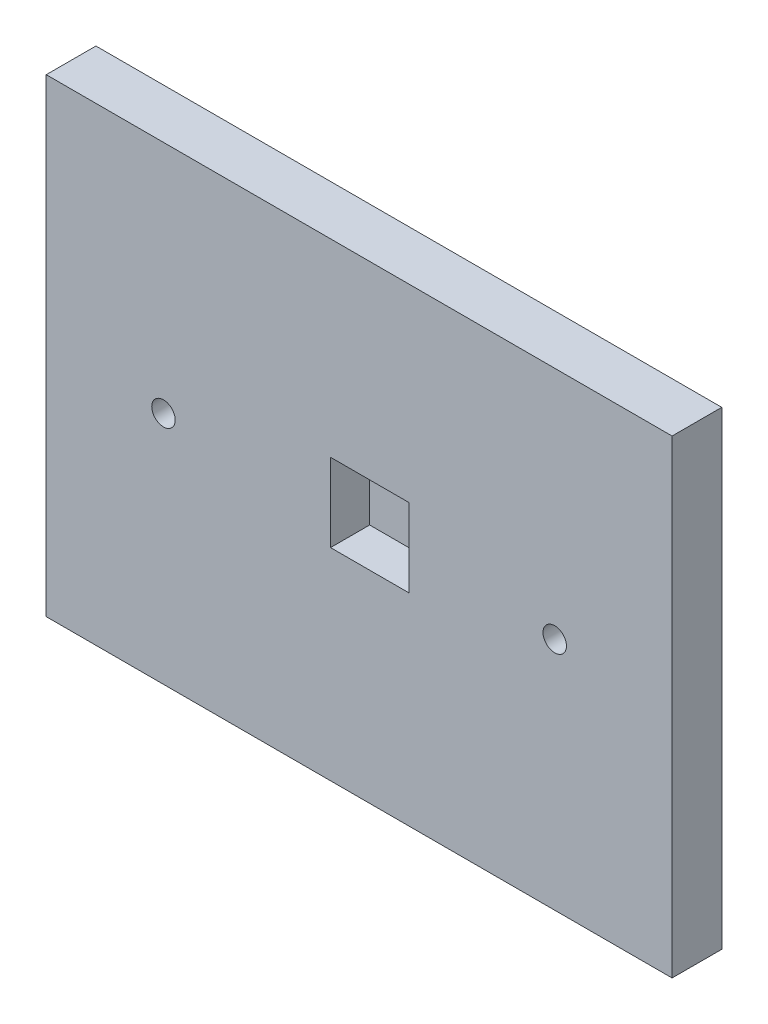
ISO-10303-21;
HEADER;
FILE_DESCRIPTION(('STEP AP214'),'2;1');
FILE_NAME('part.step','',(''),(''),'','','');
FILE_SCHEMA(('AUTOMOTIVE_DESIGN { 1 0 10303 214 1 1 1 1 }'));
ENDSEC;
DATA;
#1=APPLICATION_CONTEXT('core data for automotive mechanical design processes');
#2=APPLICATION_PROTOCOL_DEFINITION('international standard','automotive_design',2000,#1);
#3=PRODUCT_CONTEXT('',#1,'mechanical');
#4=PRODUCT('Part','Part','',(#3));
#5=PRODUCT_RELATED_PRODUCT_CATEGORY('part','',(#4));
#6=PRODUCT_DEFINITION_FORMATION('','',#4);
#7=PRODUCT_DEFINITION_CONTEXT('part definition',#1,'design');
#8=PRODUCT_DEFINITION('design','',#6,#7);
#9=PRODUCT_DEFINITION_SHAPE('','',#8);
#10=(LENGTH_UNIT() NAMED_UNIT(*) SI_UNIT(.MILLI.,.METRE.));
#11=(NAMED_UNIT(*) PLANE_ANGLE_UNIT() SI_UNIT($,.RADIAN.));
#12=(NAMED_UNIT(*) SI_UNIT($,.STERADIAN.) SOLID_ANGLE_UNIT());
#13=UNCERTAINTY_MEASURE_WITH_UNIT(LENGTH_MEASURE(1.E-05),#10,'distance_accuracy_value','');
#14=(GEOMETRIC_REPRESENTATION_CONTEXT(3) GLOBAL_UNCERTAINTY_ASSIGNED_CONTEXT((#13)) GLOBAL_UNIT_ASSIGNED_CONTEXT((#10,
#11,#12)) REPRESENTATION_CONTEXT('',''));
#15=CARTESIAN_POINT('',(0.,0.,0.));
#16=DIRECTION('',(0.,0.,1.));
#17=DIRECTION('',(1.,0.,0.));
#18=AXIS2_PLACEMENT_3D('',#15,#16,#17);
#19=CARTESIAN_POINT('',(0.,0.,12.7));
#20=DIRECTION('',(0.,0.,1.));
#21=DIRECTION('',(1.,0.,0.));
#22=AXIS2_PLACEMENT_3D('',#19,#20,#21);
#23=PLANE('',#22);
#24=DIRECTION('',(0.,1.,0.));
#25=VECTOR('',#24,1.);
#26=CARTESIAN_POINT('',(60.2204381177103,-2.07911046818367,12.7));
#27=LINE('',#26,#25);
#28=CARTESIAN_POINT('',(60.2204381177103,-22.0791104681837,12.7));
#29=VERTEX_POINT('',#28);
#30=CARTESIAN_POINT('',(60.2204381177103,-2.07911046818367,12.7));
#31=VERTEX_POINT('',#30);
#32=EDGE_CURVE('E48',#29,#31,#27,.T.);
#33=ORIENTED_EDGE('',*,*,#32,.F.);
#34=DIRECTION('',(1.,0.,0.));
#35=VECTOR('',#34,1.);
#36=CARTESIAN_POINT('',(40.2204381177103,-22.0791104681837,12.7));
#37=LINE('',#36,#35);
#38=CARTESIAN_POINT('',(40.2204381177103,-22.0791104681837,12.7));
#39=VERTEX_POINT('',#38);
#40=EDGE_CURVE('E127',#39,#29,#37,.T.);
#41=ORIENTED_EDGE('',*,*,#40,.F.);
#42=DIRECTION('',(0.,-1.,0.));
#43=VECTOR('',#42,1.);
#44=CARTESIAN_POINT('',(40.2204381177103,-2.07911046818367,12.7));
#45=LINE('',#44,#43);
#46=CARTESIAN_POINT('',(40.2204381177103,-2.07911046818367,12.7));
#47=VERTEX_POINT('',#46);
#48=EDGE_CURVE('E130',#47,#39,#45,.T.);
#49=ORIENTED_EDGE('',*,*,#48,.F.);
#50=DIRECTION('',(-1.,0.,0.));
#51=VECTOR('',#50,1.);
#52=CARTESIAN_POINT('',(40.2204381177103,-2.07911046818367,12.7));
#53=LINE('',#52,#51);
#54=EDGE_CURVE('E136',#31,#47,#53,.T.);
#55=ORIENTED_EDGE('',*,*,#54,.F.);
#56=EDGE_LOOP('',(#33,#41,#49,#55));
#57=FACE_BOUND('',#56,.T.);
#58=CARTESIAN_POINT('',(97.5422311839731,-13.7142857142857,12.7));
#59=DIRECTION('',(0.,0.,1.));
#60=DIRECTION('',(1.,0.,0.));
#61=AXIS2_PLACEMENT_3D('',#58,#59,#60);
#62=CIRCLE('',#61,3.00000000000001);
#63=CARTESIAN_POINT('',(94.5422311839731,-13.7142857142857,12.7));
#64=VERTEX_POINT('',#63);
#65=EDGE_CURVE('E152',#64,#64,#62,.T.);
#66=ORIENTED_EDGE('',*,*,#65,.F.);
#67=EDGE_LOOP('',(#66));
#68=FACE_BOUND('',#67,.T.);
#69=DIRECTION('',(0.,-1.,0.));
#70=VECTOR('',#69,1.);
#71=CARTESIAN_POINT('',(-32.4570768571429,46.2857142857143,12.7));
#72=LINE('',#71,#70);
#73=CARTESIAN_POINT('',(-32.4570768571429,46.2857142857143,12.7));
#74=VERTEX_POINT('',#73);
#75=CARTESIAN_POINT('',(-32.4570768571428,-73.7142857142857,12.7));
#76=VERTEX_POINT('',#75);
#77=EDGE_CURVE('E158',#74,#76,#72,.T.);
#78=ORIENTED_EDGE('',*,*,#77,.T.);
#79=DIRECTION('',(1.,0.,0.));
#80=VECTOR('',#79,1.);
#81=CARTESIAN_POINT('',(-32.4570768571428,-73.7142857142857,12.7));
#82=LINE('',#81,#80);
#83=CARTESIAN_POINT('',(127.542857142857,-73.7142857142857,12.7));
#84=VERTEX_POINT('',#83);
#85=EDGE_CURVE('E85',#76,#84,#82,.T.);
#86=ORIENTED_EDGE('',*,*,#85,.T.);
#87=DIRECTION('',(0.,1.,0.));
#88=VECTOR('',#87,1.);
#89=CARTESIAN_POINT('',(127.542857142857,46.2857142857143,12.7));
#90=LINE('',#89,#88);
#91=CARTESIAN_POINT('',(127.542857142857,46.2857142857143,12.7));
#92=VERTEX_POINT('',#91);
#93=EDGE_CURVE('E161',#84,#92,#90,.T.);
#94=ORIENTED_EDGE('',*,*,#93,.T.);
#95=DIRECTION('',(-1.,0.,0.));
#96=VECTOR('',#95,1.);
#97=CARTESIAN_POINT('',(-32.4570768571429,46.2857142857143,12.7));
#98=LINE('',#97,#96);
#99=EDGE_CURVE('E57',#92,#74,#98,.T.);
#100=ORIENTED_EDGE('',*,*,#99,.T.);
#101=EDGE_LOOP('',(#78,#86,#94,#100));
#102=FACE_BOUND('',#101,.T.);
#103=CARTESIAN_POINT('',(-2.48592772301937,-13.7142857142857,12.7));
#104=DIRECTION('',(0.,0.,1.));
#105=DIRECTION('',(1.,0.,0.));
#106=AXIS2_PLACEMENT_3D('',#103,#104,#105);
#107=CIRCLE('',#106,3.);
#108=CARTESIAN_POINT('',(-5.48592772301937,-13.7142857142857,12.7));
#109=VERTEX_POINT('',#108);
#110=EDGE_CURVE('E146',#109,#109,#107,.T.);
#111=ORIENTED_EDGE('',*,*,#110,.F.);
#112=EDGE_LOOP('',(#111));
#113=FACE_BOUND('',#112,.T.);
#114=ADVANCED_FACE('F33',(#57,#68,#102,#113),#23,.T.);
#115=CARTESIAN_POINT('',(0.,0.,0.));
#116=DIRECTION('',(0.,0.,1.));
#117=DIRECTION('',(1.,0.,0.));
#118=AXIS2_PLACEMENT_3D('',#115,#116,#117);
#119=PLANE('',#118);
#120=DIRECTION('',(0.,-1.,0.));
#121=VECTOR('',#120,1.);
#122=CARTESIAN_POINT('',(-32.4570768571429,46.2857142857143,0.));
#123=LINE('',#122,#121);
#124=CARTESIAN_POINT('',(-32.4570768571429,46.2857142857143,0.));
#125=VERTEX_POINT('',#124);
#126=CARTESIAN_POINT('',(-32.4570768571428,-73.7142857142857,0.));
#127=VERTEX_POINT('',#126);
#128=EDGE_CURVE('E155',#125,#127,#123,.T.);
#129=ORIENTED_EDGE('',*,*,#128,.F.);
#130=DIRECTION('',(-1.,0.,0.));
#131=VECTOR('',#130,1.);
#132=CARTESIAN_POINT('',(-32.4570768571429,46.2857142857143,0.));
#133=LINE('',#132,#131);
#134=CARTESIAN_POINT('',(127.542857142857,46.2857142857143,0.));
#135=VERTEX_POINT('',#134);
#136=EDGE_CURVE('E78',#135,#125,#133,.T.);
#137=ORIENTED_EDGE('',*,*,#136,.F.);
#138=DIRECTION('',(0.,1.,0.));
#139=VECTOR('',#138,1.);
#140=CARTESIAN_POINT('',(127.542857142857,46.2857142857143,0.));
#141=LINE('',#140,#139);
#142=CARTESIAN_POINT('',(127.542857142857,-73.7142857142857,0.));
#143=VERTEX_POINT('',#142);
#144=EDGE_CURVE('E169',#143,#135,#141,.T.);
#145=ORIENTED_EDGE('',*,*,#144,.F.);
#146=DIRECTION('',(1.,0.,0.));
#147=VECTOR('',#146,1.);
#148=CARTESIAN_POINT('',(-32.4570768571428,-73.7142857142857,0.));
#149=LINE('',#148,#147);
#150=EDGE_CURVE('E167',#127,#143,#149,.T.);
#151=ORIENTED_EDGE('',*,*,#150,.F.);
#152=EDGE_LOOP('',(#129,#137,#145,#151));
#153=FACE_BOUND('',#152,.T.);
#154=CARTESIAN_POINT('',(97.5422311839731,-13.7142857142857,0.));
#155=DIRECTION('',(0.,0.,1.));
#156=DIRECTION('',(1.,0.,0.));
#157=AXIS2_PLACEMENT_3D('',#154,#155,#156);
#158=CIRCLE('',#157,3.00000000000001);
#159=CARTESIAN_POINT('',(94.5422311839731,-13.7142857142857,0.));
#160=VERTEX_POINT('',#159);
#161=EDGE_CURVE('E149',#160,#160,#158,.T.);
#162=ORIENTED_EDGE('',*,*,#161,.T.);
#163=EDGE_LOOP('',(#162));
#164=FACE_BOUND('',#163,.T.);
#165=CARTESIAN_POINT('',(-2.48592772301937,-13.7142857142857,0.));
#166=DIRECTION('',(0.,0.,1.));
#167=DIRECTION('',(1.,0.,0.));
#168=AXIS2_PLACEMENT_3D('',#165,#166,#167);
#169=CIRCLE('',#168,3.);
#170=CARTESIAN_POINT('',(-5.48592772301937,-13.7142857142857,0.));
#171=VERTEX_POINT('',#170);
#172=EDGE_CURVE('E142',#171,#171,#169,.T.);
#173=ORIENTED_EDGE('',*,*,#172,.T.);
#174=EDGE_LOOP('',(#173));
#175=FACE_BOUND('',#174,.T.);
#176=ADVANCED_FACE('F182',(#153,#164,#175),#119,.F.);
#177=CARTESIAN_POINT('',(-32.4570768571429,46.2857142857143,12.7));
#178=DIRECTION('',(1.,0.,0.));
#179=DIRECTION('',(0.,1.,0.));
#180=AXIS2_PLACEMENT_3D('',#177,#178,#179);
#181=PLANE('',#180);
#182=ORIENTED_EDGE('',*,*,#128,.T.);
#183=DIRECTION('',(0.,0.,-1.));
#184=VECTOR('',#183,1.);
#185=CARTESIAN_POINT('',(-32.4570768571428,-73.7142857142857,12.7));
#186=LINE('',#185,#184);
#187=EDGE_CURVE('E11',#76,#127,#186,.T.);
#188=ORIENTED_EDGE('',*,*,#187,.F.);
#189=ORIENTED_EDGE('',*,*,#77,.F.);
#190=DIRECTION('',(0.,0.,-1.));
#191=VECTOR('',#190,1.);
#192=CARTESIAN_POINT('',(-32.4570768571429,46.2857142857143,12.7));
#193=LINE('',#192,#191);
#194=EDGE_CURVE('E164',#74,#125,#193,.T.);
#195=ORIENTED_EDGE('',*,*,#194,.T.);
#196=EDGE_LOOP('',(#182,#188,#189,#195));
#197=FACE_BOUND('',#196,.T.);
#198=ADVANCED_FACE('F35',(#197),#181,.F.);
#199=CARTESIAN_POINT('',(-32.4570768571428,-73.7142857142857,12.7));
#200=DIRECTION('',(0.,1.,0.));
#201=DIRECTION('',(0.,0.,1.));
#202=AXIS2_PLACEMENT_3D('',#199,#200,#201);
#203=PLANE('',#202);
#204=ORIENTED_EDGE('',*,*,#150,.T.);
#205=DIRECTION('',(0.,0.,-1.));
#206=VECTOR('',#205,1.);
#207=CARTESIAN_POINT('',(127.542857142857,-73.7142857142857,12.7));
#208=LINE('',#207,#206);
#209=EDGE_CURVE('E41',#84,#143,#208,.T.);
#210=ORIENTED_EDGE('',*,*,#209,.F.);
#211=ORIENTED_EDGE('',*,*,#85,.F.);
#212=ORIENTED_EDGE('',*,*,#187,.T.);
#213=EDGE_LOOP('',(#204,#210,#211,#212));
#214=FACE_BOUND('',#213,.T.);
#215=ADVANCED_FACE('F198',(#214),#203,.F.);
#216=CARTESIAN_POINT('',(127.542857142857,46.2857142857143,12.7));
#217=DIRECTION('',(-1.,0.,0.));
#218=DIRECTION('',(0.,0.,1.));
#219=AXIS2_PLACEMENT_3D('',#216,#217,#218);
#220=PLANE('',#219);
#221=ORIENTED_EDGE('',*,*,#144,.T.);
#222=DIRECTION('',(0.,0.,-1.));
#223=VECTOR('',#222,1.);
#224=CARTESIAN_POINT('',(127.542857142857,46.2857142857143,12.7));
#225=LINE('',#224,#223);
#226=EDGE_CURVE('E173',#92,#135,#225,.T.);
#227=ORIENTED_EDGE('',*,*,#226,.F.);
#228=ORIENTED_EDGE('',*,*,#93,.F.);
#229=ORIENTED_EDGE('',*,*,#209,.T.);
#230=EDGE_LOOP('',(#221,#227,#228,#229));
#231=FACE_BOUND('',#230,.T.);
#232=ADVANCED_FACE('F178',(#231),#220,.F.);
#233=CARTESIAN_POINT('',(-32.4570768571429,46.2857142857143,12.7));
#234=DIRECTION('',(0.,-1.,0.));
#235=DIRECTION('',(0.,0.,-1.));
#236=AXIS2_PLACEMENT_3D('',#233,#234,#235);
#237=PLANE('',#236);
#238=ORIENTED_EDGE('',*,*,#136,.T.);
#239=ORIENTED_EDGE('',*,*,#194,.F.);
#240=ORIENTED_EDGE('',*,*,#99,.F.);
#241=ORIENTED_EDGE('',*,*,#226,.T.);
#242=EDGE_LOOP('',(#238,#239,#240,#241));
#243=FACE_BOUND('',#242,.T.);
#244=ADVANCED_FACE('F187',(#243),#237,.F.);
#245=CARTESIAN_POINT('',(97.5422311839731,-13.7142857142857,12.7));
#246=DIRECTION('',(0.,0.,-1.));
#247=DIRECTION('',(-1.,0.,0.));
#248=AXIS2_PLACEMENT_3D('',#245,#246,#247);
#249=CYLINDRICAL_SURFACE('',#248,3.00000000000001);
#250=CARTESIAN_POINT('',(94.5422311839731,-13.7142857142857,12.7));
#251=CARTESIAN_POINT('',(94.5422311839731,-13.7142857142857,12.5677083333333));
#252=CARTESIAN_POINT('',(94.5422311839731,-13.7142857142857,12.4354166666667));
#253=CARTESIAN_POINT('',(94.5422311839731,-13.7142857142857,12.1708333333333));
#254=CARTESIAN_POINT('',(94.5422311839731,-13.7142857142857,12.0385416666667));
#255=CARTESIAN_POINT('',(94.5422311839731,-13.7142857142857,11.7739583333333));
#256=CARTESIAN_POINT('',(94.5422311839731,-13.7142857142857,11.6416666666667));
#257=CARTESIAN_POINT('',(94.5422311839731,-13.7142857142857,11.3770833333333));
#258=CARTESIAN_POINT('',(94.5422311839731,-13.7142857142857,11.2447916666667));
#259=CARTESIAN_POINT('',(94.5422311839731,-13.7142857142857,10.9802083333333));
#260=CARTESIAN_POINT('',(94.5422311839731,-13.7142857142857,10.8479166666667));
#261=CARTESIAN_POINT('',(94.5422311839731,-13.7142857142857,10.5833333333333));
#262=CARTESIAN_POINT('',(94.5422311839731,-13.7142857142857,10.4510416666667));
#263=CARTESIAN_POINT('',(94.5422311839731,-13.7142857142857,10.1864583333333));
#264=CARTESIAN_POINT('',(94.5422311839731,-13.7142857142857,10.0541666666667));
#265=CARTESIAN_POINT('',(94.5422311839731,-13.7142857142857,9.78958333333333));
#266=CARTESIAN_POINT('',(94.5422311839731,-13.7142857142857,9.65729166666667));
#267=CARTESIAN_POINT('',(94.5422311839731,-13.7142857142857,9.39270833333333));
#268=CARTESIAN_POINT('',(94.5422311839731,-13.7142857142857,9.26041666666667));
#269=CARTESIAN_POINT('',(94.5422311839731,-13.7142857142857,8.99583333333333));
#270=CARTESIAN_POINT('',(94.5422311839731,-13.7142857142857,8.86354166666667));
#271=CARTESIAN_POINT('',(94.5422311839731,-13.7142857142857,8.59895833333333));
#272=CARTESIAN_POINT('',(94.5422311839731,-13.7142857142857,8.46666666666667));
#273=CARTESIAN_POINT('',(94.5422311839731,-13.7142857142857,8.20208333333333));
#274=CARTESIAN_POINT('',(94.5422311839731,-13.7142857142857,8.06979166666667));
#275=CARTESIAN_POINT('',(94.5422311839731,-13.7142857142857,7.80520833333333));
#276=CARTESIAN_POINT('',(94.5422311839731,-13.7142857142857,7.67291666666667));
#277=CARTESIAN_POINT('',(94.5422311839731,-13.7142857142857,7.40833333333333));
#278=CARTESIAN_POINT('',(94.5422311839731,-13.7142857142857,7.27604166666667));
#279=CARTESIAN_POINT('',(94.5422311839731,-13.7142857142857,7.01145833333333));
#280=CARTESIAN_POINT('',(94.5422311839731,-13.7142857142857,6.87916666666667));
#281=CARTESIAN_POINT('',(94.5422311839731,-13.7142857142857,6.61458333333333));
#282=CARTESIAN_POINT('',(94.5422311839731,-13.7142857142857,6.48229166666667));
#283=CARTESIAN_POINT('',(94.5422311839731,-13.7142857142857,6.21770833333333));
#284=CARTESIAN_POINT('',(94.5422311839731,-13.7142857142857,6.08541666666667));
#285=CARTESIAN_POINT('',(94.5422311839731,-13.7142857142857,5.82083333333333));
#286=CARTESIAN_POINT('',(94.5422311839731,-13.7142857142857,5.68854166666667));
#287=CARTESIAN_POINT('',(94.5422311839731,-13.7142857142857,5.42395833333333));
#288=CARTESIAN_POINT('',(94.5422311839731,-13.7142857142857,5.29166666666667));
#289=CARTESIAN_POINT('',(94.5422311839731,-13.7142857142857,5.02708333333333));
#290=CARTESIAN_POINT('',(94.5422311839731,-13.7142857142857,4.89479166666667));
#291=CARTESIAN_POINT('',(94.5422311839731,-13.7142857142857,4.63020833333333));
#292=CARTESIAN_POINT('',(94.5422311839731,-13.7142857142857,4.49791666666667));
#293=CARTESIAN_POINT('',(94.5422311839731,-13.7142857142857,4.23333333333333));
#294=CARTESIAN_POINT('',(94.5422311839731,-13.7142857142857,4.10104166666667));
#295=CARTESIAN_POINT('',(94.5422311839731,-13.7142857142857,3.83645833333333));
#296=CARTESIAN_POINT('',(94.5422311839731,-13.7142857142857,3.70416666666667));
#297=CARTESIAN_POINT('',(94.5422311839731,-13.7142857142857,3.43958333333333));
#298=CARTESIAN_POINT('',(94.5422311839731,-13.7142857142857,3.30729166666667));
#299=CARTESIAN_POINT('',(94.5422311839731,-13.7142857142857,3.04270833333333));
#300=CARTESIAN_POINT('',(94.5422311839731,-13.7142857142857,2.91041666666667));
#301=CARTESIAN_POINT('',(94.5422311839731,-13.7142857142857,2.64583333333333));
#302=CARTESIAN_POINT('',(94.5422311839731,-13.7142857142857,2.51354166666667));
#303=CARTESIAN_POINT('',(94.5422311839731,-13.7142857142857,2.24895833333333));
#304=CARTESIAN_POINT('',(94.5422311839731,-13.7142857142857,2.11666666666667));
#305=CARTESIAN_POINT('',(94.5422311839731,-13.7142857142857,1.85208333333333));
#306=CARTESIAN_POINT('',(94.5422311839731,-13.7142857142857,1.71979166666667));
#307=CARTESIAN_POINT('',(94.5422311839731,-13.7142857142857,1.45520833333333));
#308=CARTESIAN_POINT('',(94.5422311839731,-13.7142857142857,1.32291666666667));
#309=CARTESIAN_POINT('',(94.5422311839731,-13.7142857142857,1.05833333333333));
#310=CARTESIAN_POINT('',(94.5422311839731,-13.7142857142857,0.926041666666666));
#311=CARTESIAN_POINT('',(94.5422311839731,-13.7142857142857,0.661458333333333));
#312=CARTESIAN_POINT('',(94.5422311839731,-13.7142857142857,0.529166666666666));
#313=CARTESIAN_POINT('',(94.5422311839731,-13.7142857142857,0.264583333333333));
#314=CARTESIAN_POINT('',(94.5422311839731,-13.7142857142857,0.132291666666667));
#315=CARTESIAN_POINT('',(94.5422311839731,-13.7142857142857,0.));
#316=B_SPLINE_CURVE_WITH_KNOTS('',3,(#250,#251,#252,#253,#254,#255,#256,#257,#258,#259,#260,
#261,#262,#263,#264,#265,#266,#267,#268,#269,#270,#271,#272,#273,#274,#275,#276,#277,#278,#279,
#280,#281,#282,#283,#284,#285,#286,#287,#288,#289,#290,#291,#292,#293,#294,#295,#296,#297,#298,
#299,#300,#301,#302,#303,#304,#305,#306,#307,#308,#309,#310,#311,#312,#313,#314,#315),
.UNSPECIFIED.,.F.,.F.,(4,2,2,2,2,2,2,2,2,2,2,2,2,2,2,2,2,2,2,2,2,2,2,2,2,2,2,2,2,2,2,2,4),(0.,
0.396875000000001,0.793750000000001,1.190625,1.5875,1.984375,2.38125,2.778125,3.175,3.571875,
3.96875,4.365625,4.7625,5.159375,5.55625,5.953125,6.35,6.746875,7.14375,7.540625,7.9375,
8.334375,8.73125,9.128125,9.525,9.921875,10.31875,10.715625,11.1125,11.509375,11.90625,
12.303125,12.7),.UNSPECIFIED.);
#317=EDGE_CURVE('BSEAM189',#64,#160,#316,.T.);
#318=ORIENTED_EDGE('',*,*,#65,.T.);
#319=ORIENTED_EDGE('',*,*,#161,.F.);
#320=ORIENTED_EDGE('',*,*,#317,.T.);
#321=ORIENTED_EDGE('',*,*,#317,.F.);
#322=EDGE_LOOP('',(#318,#320,#319,#321));
#323=FACE_BOUND('',#322,.T.);
#324=ADVANCED_FACE('F189',(#323),#249,.F.);
#325=CARTESIAN_POINT('',(-2.48592772301937,-13.7142857142857,12.7));
#326=DIRECTION('',(0.,0.,-1.));
#327=DIRECTION('',(-1.,0.,0.));
#328=AXIS2_PLACEMENT_3D('',#325,#326,#327);
#329=CYLINDRICAL_SURFACE('',#328,3.);
#330=CARTESIAN_POINT('',(-5.48592772301937,-13.7142857142857,12.7));
#331=CARTESIAN_POINT('',(-5.48592772301937,-13.7142857142857,12.5677083333333));
#332=CARTESIAN_POINT('',(-5.48592772301937,-13.7142857142857,12.4354166666667));
#333=CARTESIAN_POINT('',(-5.48592772301937,-13.7142857142857,12.1708333333333));
#334=CARTESIAN_POINT('',(-5.48592772301937,-13.7142857142857,12.0385416666667));
#335=CARTESIAN_POINT('',(-5.48592772301937,-13.7142857142857,11.7739583333333));
#336=CARTESIAN_POINT('',(-5.48592772301937,-13.7142857142857,11.6416666666667));
#337=CARTESIAN_POINT('',(-5.48592772301937,-13.7142857142857,11.3770833333333));
#338=CARTESIAN_POINT('',(-5.48592772301937,-13.7142857142857,11.2447916666667));
#339=CARTESIAN_POINT('',(-5.48592772301937,-13.7142857142857,10.9802083333333));
#340=CARTESIAN_POINT('',(-5.48592772301937,-13.7142857142857,10.8479166666667));
#341=CARTESIAN_POINT('',(-5.48592772301937,-13.7142857142857,10.5833333333333));
#342=CARTESIAN_POINT('',(-5.48592772301937,-13.7142857142857,10.4510416666667));
#343=CARTESIAN_POINT('',(-5.48592772301937,-13.7142857142857,10.1864583333333));
#344=CARTESIAN_POINT('',(-5.48592772301937,-13.7142857142857,10.0541666666667));
#345=CARTESIAN_POINT('',(-5.48592772301937,-13.7142857142857,9.78958333333333));
#346=CARTESIAN_POINT('',(-5.48592772301937,-13.7142857142857,9.65729166666667));
#347=CARTESIAN_POINT('',(-5.48592772301937,-13.7142857142857,9.39270833333333));
#348=CARTESIAN_POINT('',(-5.48592772301937,-13.7142857142857,9.26041666666667));
#349=CARTESIAN_POINT('',(-5.48592772301937,-13.7142857142857,8.99583333333333));
#350=CARTESIAN_POINT('',(-5.48592772301937,-13.7142857142857,8.86354166666667));
#351=CARTESIAN_POINT('',(-5.48592772301937,-13.7142857142857,8.59895833333333));
#352=CARTESIAN_POINT('',(-5.48592772301937,-13.7142857142857,8.46666666666667));
#353=CARTESIAN_POINT('',(-5.48592772301937,-13.7142857142857,8.20208333333333));
#354=CARTESIAN_POINT('',(-5.48592772301937,-13.7142857142857,8.06979166666667));
#355=CARTESIAN_POINT('',(-5.48592772301937,-13.7142857142857,7.80520833333333));
#356=CARTESIAN_POINT('',(-5.48592772301937,-13.7142857142857,7.67291666666667));
#357=CARTESIAN_POINT('',(-5.48592772301937,-13.7142857142857,7.40833333333333));
#358=CARTESIAN_POINT('',(-5.48592772301937,-13.7142857142857,7.27604166666667));
#359=CARTESIAN_POINT('',(-5.48592772301937,-13.7142857142857,7.01145833333333));
#360=CARTESIAN_POINT('',(-5.48592772301937,-13.7142857142857,6.87916666666667));
#361=CARTESIAN_POINT('',(-5.48592772301937,-13.7142857142857,6.61458333333333));
#362=CARTESIAN_POINT('',(-5.48592772301937,-13.7142857142857,6.48229166666667));
#363=CARTESIAN_POINT('',(-5.48592772301937,-13.7142857142857,6.21770833333333));
#364=CARTESIAN_POINT('',(-5.48592772301937,-13.7142857142857,6.08541666666667));
#365=CARTESIAN_POINT('',(-5.48592772301937,-13.7142857142857,5.82083333333333));
#366=CARTESIAN_POINT('',(-5.48592772301937,-13.7142857142857,5.68854166666667));
#367=CARTESIAN_POINT('',(-5.48592772301937,-13.7142857142857,5.42395833333333));
#368=CARTESIAN_POINT('',(-5.48592772301937,-13.7142857142857,5.29166666666667));
#369=CARTESIAN_POINT('',(-5.48592772301937,-13.7142857142857,5.02708333333333));
#370=CARTESIAN_POINT('',(-5.48592772301937,-13.7142857142857,4.89479166666667));
#371=CARTESIAN_POINT('',(-5.48592772301937,-13.7142857142857,4.63020833333333));
#372=CARTESIAN_POINT('',(-5.48592772301937,-13.7142857142857,4.49791666666667));
#373=CARTESIAN_POINT('',(-5.48592772301937,-13.7142857142857,4.23333333333333));
#374=CARTESIAN_POINT('',(-5.48592772301937,-13.7142857142857,4.10104166666667));
#375=CARTESIAN_POINT('',(-5.48592772301937,-13.7142857142857,3.83645833333333));
#376=CARTESIAN_POINT('',(-5.48592772301937,-13.7142857142857,3.70416666666667));
#377=CARTESIAN_POINT('',(-5.48592772301937,-13.7142857142857,3.43958333333333));
#378=CARTESIAN_POINT('',(-5.48592772301937,-13.7142857142857,3.30729166666667));
#379=CARTESIAN_POINT('',(-5.48592772301937,-13.7142857142857,3.04270833333333));
#380=CARTESIAN_POINT('',(-5.48592772301937,-13.7142857142857,2.91041666666667));
#381=CARTESIAN_POINT('',(-5.48592772301937,-13.7142857142857,2.64583333333333));
#382=CARTESIAN_POINT('',(-5.48592772301937,-13.7142857142857,2.51354166666667));
#383=CARTESIAN_POINT('',(-5.48592772301937,-13.7142857142857,2.24895833333333));
#384=CARTESIAN_POINT('',(-5.48592772301937,-13.7142857142857,2.11666666666667));
#385=CARTESIAN_POINT('',(-5.48592772301937,-13.7142857142857,1.85208333333333));
#386=CARTESIAN_POINT('',(-5.48592772301937,-13.7142857142857,1.71979166666667));
#387=CARTESIAN_POINT('',(-5.48592772301937,-13.7142857142857,1.45520833333333));
#388=CARTESIAN_POINT('',(-5.48592772301937,-13.7142857142857,1.32291666666667));
#389=CARTESIAN_POINT('',(-5.48592772301937,-13.7142857142857,1.05833333333333));
#390=CARTESIAN_POINT('',(-5.48592772301937,-13.7142857142857,0.926041666666666));
#391=CARTESIAN_POINT('',(-5.48592772301937,-13.7142857142857,0.661458333333333));
#392=CARTESIAN_POINT('',(-5.48592772301937,-13.7142857142857,0.529166666666666));
#393=CARTESIAN_POINT('',(-5.48592772301937,-13.7142857142857,0.264583333333333));
#394=CARTESIAN_POINT('',(-5.48592772301937,-13.7142857142857,0.132291666666667));
#395=CARTESIAN_POINT('',(-5.48592772301937,-13.7142857142857,0.));
#396=B_SPLINE_CURVE_WITH_KNOTS('',3,(#330,#331,#332,#333,#334,#335,#336,#337,#338,#339,#340,
#341,#342,#343,#344,#345,#346,#347,#348,#349,#350,#351,#352,#353,#354,#355,#356,#357,#358,#359,
#360,#361,#362,#363,#364,#365,#366,#367,#368,#369,#370,#371,#372,#373,#374,#375,#376,#377,#378,
#379,#380,#381,#382,#383,#384,#385,#386,#387,#388,#389,#390,#391,#392,#393,#394,#395),
.UNSPECIFIED.,.F.,.F.,(4,2,2,2,2,2,2,2,2,2,2,2,2,2,2,2,2,2,2,2,2,2,2,2,2,2,2,2,2,2,2,2,4),(0.,
0.396875000000001,0.793750000000001,1.190625,1.5875,1.984375,2.38125,2.778125,3.175,3.571875,
3.96875,4.365625,4.7625,5.159375,5.55625,5.953125,6.35,6.746875,7.14375,7.540625,7.9375,
8.334375,8.73125,9.128125,9.525,9.921875,10.31875,10.715625,11.1125,11.509375,11.90625,
12.303125,12.7),.UNSPECIFIED.);
#397=EDGE_CURVE('BSEAM195',#109,#171,#396,.T.);
#398=ORIENTED_EDGE('',*,*,#110,.T.);
#399=ORIENTED_EDGE('',*,*,#172,.F.);
#400=ORIENTED_EDGE('',*,*,#397,.T.);
#401=ORIENTED_EDGE('',*,*,#397,.F.);
#402=EDGE_LOOP('',(#398,#400,#399,#401));
#403=FACE_BOUND('',#402,.T.);
#404=ADVANCED_FACE('F195',(#403),#329,.F.);
#405=CARTESIAN_POINT('',(60.2204381177103,-2.07911046818367,2.7));
#406=DIRECTION('',(1.,0.,0.));
#407=DIRECTION('',(0.,0.,-1.));
#408=AXIS2_PLACEMENT_3D('',#405,#406,#407);
#409=PLANE('',#408);
#410=ORIENTED_EDGE('',*,*,#32,.T.);
#411=DIRECTION('',(0.,0.,1.));
#412=VECTOR('',#411,1.);
#413=CARTESIAN_POINT('',(60.2204381177103,-2.07911046818367,2.7));
#414=LINE('',#413,#412);
#415=CARTESIAN_POINT('',(60.2204381177103,-2.07911046818367,2.7));
#416=VERTEX_POINT('',#415);
#417=EDGE_CURVE('E105',#416,#31,#414,.T.);
#418=ORIENTED_EDGE('',*,*,#417,.F.);
#419=DIRECTION('',(0.,1.,0.));
#420=VECTOR('',#419,1.);
#421=CARTESIAN_POINT('',(60.2204381177103,-2.07911046818367,2.7));
#422=LINE('',#421,#420);
#423=CARTESIAN_POINT('',(60.2204381177103,-22.0791104681837,2.7));
#424=VERTEX_POINT('',#423);
#425=EDGE_CURVE('E109',#424,#416,#422,.T.);
#426=ORIENTED_EDGE('',*,*,#425,.F.);
#427=DIRECTION('',(0.,0.,1.));
#428=VECTOR('',#427,1.);
#429=CARTESIAN_POINT('',(60.2204381177103,-22.0791104681837,2.7));
#430=LINE('',#429,#428);
#431=EDGE_CURVE('E140',#424,#29,#430,.T.);
#432=ORIENTED_EDGE('',*,*,#431,.T.);
#433=EDGE_LOOP('',(#410,#418,#426,#432));
#434=FACE_BOUND('',#433,.T.);
#435=ADVANCED_FACE('F107',(#434),#409,.F.);
#436=CARTESIAN_POINT('',(40.2204381177103,-22.0791104681837,2.7));
#437=DIRECTION('',(0.,-1.,0.));
#438=DIRECTION('',(0.,0.,-1.));
#439=AXIS2_PLACEMENT_3D('',#436,#437,#438);
#440=PLANE('',#439);
#441=ORIENTED_EDGE('',*,*,#40,.T.);
#442=ORIENTED_EDGE('',*,*,#431,.F.);
#443=DIRECTION('',(1.,0.,0.));
#444=VECTOR('',#443,1.);
#445=CARTESIAN_POINT('',(40.2204381177103,-22.0791104681837,2.7));
#446=LINE('',#445,#444);
#447=CARTESIAN_POINT('',(40.2204381177103,-22.0791104681837,2.7));
#448=VERTEX_POINT('',#447);
#449=EDGE_CURVE('E115',#448,#424,#446,.T.);
#450=ORIENTED_EDGE('',*,*,#449,.F.);
#451=DIRECTION('',(0.,0.,1.));
#452=VECTOR('',#451,1.);
#453=CARTESIAN_POINT('',(40.2204381177103,-22.0791104681837,2.7));
#454=LINE('',#453,#452);
#455=EDGE_CURVE('E143',#448,#39,#454,.T.);
#456=ORIENTED_EDGE('',*,*,#455,.T.);
#457=EDGE_LOOP('',(#441,#442,#450,#456));
#458=FACE_BOUND('',#457,.T.);
#459=ADVANCED_FACE('F214',(#458),#440,.F.);
#460=CARTESIAN_POINT('',(40.2204381177103,-2.07911046818367,2.7));
#461=DIRECTION('',(-1.,0.,0.));
#462=DIRECTION('',(0.,0.,1.));
#463=AXIS2_PLACEMENT_3D('',#460,#461,#462);
#464=PLANE('',#463);
#465=ORIENTED_EDGE('',*,*,#48,.T.);
#466=ORIENTED_EDGE('',*,*,#455,.F.);
#467=DIRECTION('',(0.,-1.,0.));
#468=VECTOR('',#467,1.);
#469=CARTESIAN_POINT('',(40.2204381177103,-2.07911046818367,2.7));
#470=LINE('',#469,#468);
#471=CARTESIAN_POINT('',(40.2204381177103,-2.07911046818367,2.7));
#472=VERTEX_POINT('',#471);
#473=EDGE_CURVE('E123',#472,#448,#470,.T.);
#474=ORIENTED_EDGE('',*,*,#473,.F.);
#475=DIRECTION('',(0.,0.,1.));
#476=VECTOR('',#475,1.);
#477=CARTESIAN_POINT('',(40.2204381177103,-2.07911046818367,2.7));
#478=LINE('',#477,#476);
#479=EDGE_CURVE('E114',#472,#47,#478,.T.);
#480=ORIENTED_EDGE('',*,*,#479,.T.);
#481=EDGE_LOOP('',(#465,#466,#474,#480));
#482=FACE_BOUND('',#481,.T.);
#483=ADVANCED_FACE('F217',(#482),#464,.F.);
#484=CARTESIAN_POINT('',(40.2204381177103,-2.07911046818367,2.7));
#485=DIRECTION('',(0.,1.,0.));
#486=DIRECTION('',(0.,0.,1.));
#487=AXIS2_PLACEMENT_3D('',#484,#485,#486);
#488=PLANE('',#487);
#489=ORIENTED_EDGE('',*,*,#54,.T.);
#490=ORIENTED_EDGE('',*,*,#479,.F.);
#491=DIRECTION('',(-1.,0.,0.));
#492=VECTOR('',#491,1.);
#493=CARTESIAN_POINT('',(40.2204381177103,-2.07911046818367,2.7));
#494=LINE('',#493,#492);
#495=EDGE_CURVE('E118',#416,#472,#494,.T.);
#496=ORIENTED_EDGE('',*,*,#495,.F.);
#497=ORIENTED_EDGE('',*,*,#417,.T.);
#498=EDGE_LOOP('',(#489,#490,#496,#497));
#499=FACE_BOUND('',#498,.T.);
#500=ADVANCED_FACE('F119',(#499),#488,.F.);
#501=CARTESIAN_POINT('',(0.,0.,2.7));
#502=DIRECTION('',(0.,0.,1.));
#503=DIRECTION('',(1.,0.,0.));
#504=AXIS2_PLACEMENT_3D('',#501,#502,#503);
#505=PLANE('',#504);
#506=ORIENTED_EDGE('',*,*,#425,.T.);
#507=ORIENTED_EDGE('',*,*,#495,.T.);
#508=ORIENTED_EDGE('',*,*,#473,.T.);
#509=ORIENTED_EDGE('',*,*,#449,.T.);
#510=EDGE_LOOP('',(#506,#507,#508,#509));
#511=FACE_BOUND('',#510,.T.);
#512=ADVANCED_FACE('F125',(#511),#505,.T.);
#513=CLOSED_SHELL('',(#114,#176,#198,#215,#232,#244,#324,#404,#435,#459,#483,#500,#512));
#514=MANIFOLD_SOLID_BREP('B2',#513);
#515=ADVANCED_BREP_SHAPE_REPRESENTATION('',(#18,#514),#14);
#516=SHAPE_DEFINITION_REPRESENTATION(#9,#515);
ENDSEC;
END-ISO-10303-21;
